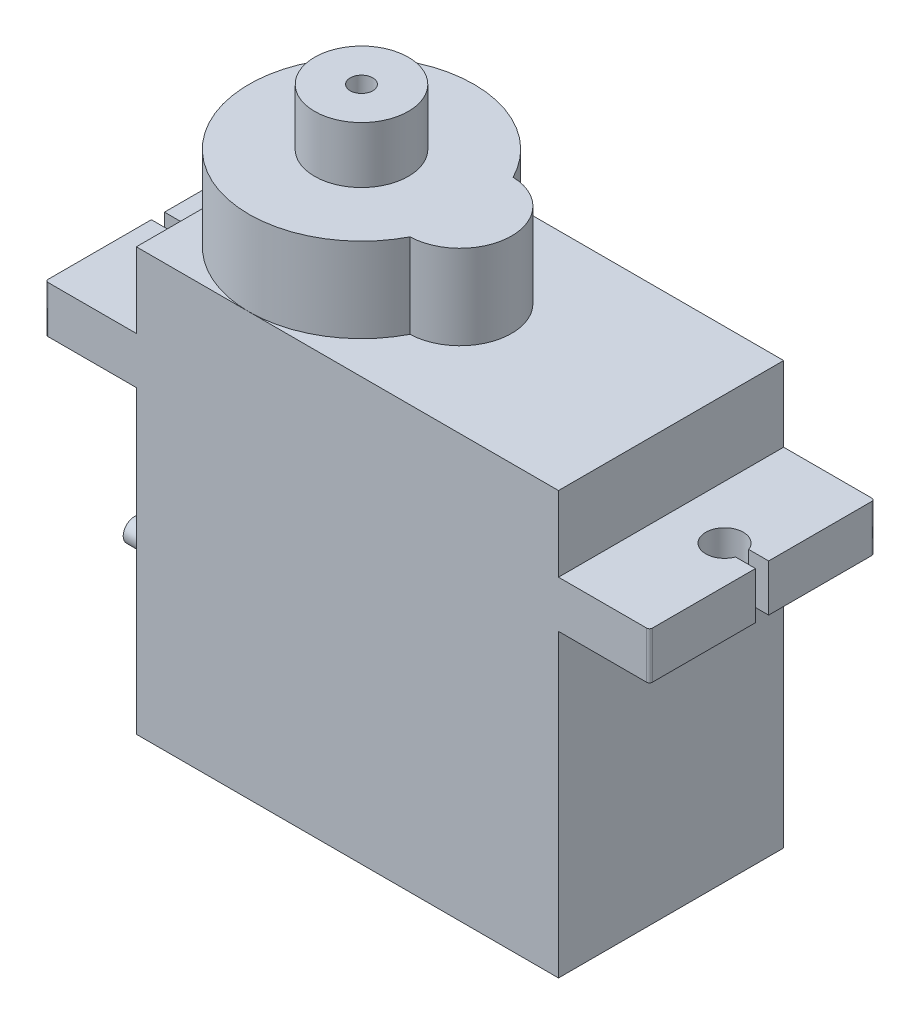
ISO-10303-21;
HEADER;
FILE_DESCRIPTION(('STEP AP214'),'2;1');
FILE_NAME('part.step','',(''),(''),'','','');
FILE_SCHEMA(('AUTOMOTIVE_DESIGN { 1 0 10303 214 1 1 1 1 }'));
ENDSEC;
DATA;
#1=APPLICATION_CONTEXT('core data for automotive mechanical design processes');
#2=APPLICATION_PROTOCOL_DEFINITION('international standard','automotive_design',2000,#1);
#3=PRODUCT_CONTEXT('',#1,'mechanical');
#4=PRODUCT('Part','Part','',(#3));
#5=PRODUCT_RELATED_PRODUCT_CATEGORY('part','',(#4));
#6=PRODUCT_DEFINITION_FORMATION('','',#4);
#7=PRODUCT_DEFINITION_CONTEXT('part definition',#1,'design');
#8=PRODUCT_DEFINITION('design','',#6,#7);
#9=PRODUCT_DEFINITION_SHAPE('','',#8);
#10=(LENGTH_UNIT() NAMED_UNIT(*) SI_UNIT(.MILLI.,.METRE.));
#11=(NAMED_UNIT(*) PLANE_ANGLE_UNIT() SI_UNIT($,.RADIAN.));
#12=(NAMED_UNIT(*) SI_UNIT($,.STERADIAN.) SOLID_ANGLE_UNIT());
#13=UNCERTAINTY_MEASURE_WITH_UNIT(LENGTH_MEASURE(1.E-05),#10,'distance_accuracy_value','');
#14=(GEOMETRIC_REPRESENTATION_CONTEXT(3) GLOBAL_UNCERTAINTY_ASSIGNED_CONTEXT((#13)) GLOBAL_UNIT_ASSIGNED_CONTEXT((#10,
#11,#12)) REPRESENTATION_CONTEXT('',''));
#15=CARTESIAN_POINT('',(0.,0.,0.));
#16=DIRECTION('',(0.,0.,1.));
#17=DIRECTION('',(1.,0.,0.));
#18=AXIS2_PLACEMENT_3D('',#15,#16,#17);
#19=CARTESIAN_POINT('',(11.25,-22.5,6.));
#20=DIRECTION('',(1.,0.,0.));
#21=DIRECTION('',(0.,0.,-1.));
#22=AXIS2_PLACEMENT_3D('',#19,#20,#21);
#23=PLANE('',#22);
#24=DIRECTION('',(0.,1.,0.));
#25=VECTOR('',#24,1.);
#26=CARTESIAN_POINT('',(11.25,-22.5,-6.));
#27=LINE('',#26,#25);
#28=CARTESIAN_POINT('',(11.25,-22.5,-6.));
#29=VERTEX_POINT('',#28);
#30=CARTESIAN_POINT('',(11.25,-6.50000000000001,-6.));
#31=VERTEX_POINT('',#30);
#32=EDGE_CURVE('E498',#29,#31,#27,.T.);
#33=ORIENTED_EDGE('',*,*,#32,.T.);
#34=DIRECTION('',(0.,0.,1.));
#35=VECTOR('',#34,1.);
#36=CARTESIAN_POINT('',(11.25,-6.5,6.));
#37=LINE('',#36,#35);
#38=CARTESIAN_POINT('',(11.25,-6.50000000000001,6.));
#39=VERTEX_POINT('',#38);
#40=EDGE_CURVE('E402',#31,#39,#37,.T.);
#41=ORIENTED_EDGE('',*,*,#40,.T.);
#42=DIRECTION('',(0.,1.,0.));
#43=VECTOR('',#42,1.);
#44=CARTESIAN_POINT('',(11.25,-22.5,6.));
#45=LINE('',#44,#43);
#46=CARTESIAN_POINT('',(11.25,-22.5,6.));
#47=VERTEX_POINT('',#46);
#48=EDGE_CURVE('E483',#47,#39,#45,.T.);
#49=ORIENTED_EDGE('',*,*,#48,.F.);
#50=DIRECTION('',(0.,0.,-1.));
#51=VECTOR('',#50,1.);
#52=CARTESIAN_POINT('',(11.25,-22.5,6.));
#53=LINE('',#52,#51);
#54=EDGE_CURVE('E448',#47,#29,#53,.T.);
#55=ORIENTED_EDGE('',*,*,#54,.T.);
#56=EDGE_LOOP('',(#33,#41,#49,#55));
#57=FACE_BOUND('',#56,.T.);
#58=ADVANCED_FACE('F43',(#57),#23,.T.);
#59=CARTESIAN_POINT('',(-11.25,-22.5,6.));
#60=DIRECTION('',(-1.,0.,0.));
#61=DIRECTION('',(0.,0.,1.));
#62=AXIS2_PLACEMENT_3D('',#59,#60,#61);
#63=PLANE('',#62);
#64=CARTESIAN_POINT('',(-11.25,-18.,0.));
#65=DIRECTION('',(-1.,0.,0.));
#66=DIRECTION('',(0.,0.,1.));
#67=AXIS2_PLACEMENT_3D('',#64,#65,#66);
#68=CIRCLE('',#67,0.6);
#69=CARTESIAN_POINT('',(-11.25,-17.7602084238344,0.55));
#70=VERTEX_POINT('',#69);
#71=CARTESIAN_POINT('',(-11.25,-17.7602084238344,-0.549999999999997));
#72=VERTEX_POINT('',#71);
#73=EDGE_CURVE('E1036',#70,#72,#68,.T.);
#74=ORIENTED_EDGE('',*,*,#73,.F.);
#75=CARTESIAN_POINT('',(-11.25,-18.,1.1));
#76=DIRECTION('',(-1.,0.,0.));
#77=DIRECTION('',(0.,0.,1.));
#78=AXIS2_PLACEMENT_3D('',#75,#76,#77);
#79=CIRCLE('',#78,0.6);
#80=CARTESIAN_POINT('',(-11.25,-18.2397915761656,0.55));
#81=VERTEX_POINT('',#80);
#82=EDGE_CURVE('E278',#81,#70,#79,.T.);
#83=ORIENTED_EDGE('',*,*,#82,.F.);
#84=CARTESIAN_POINT('',(-11.25,-18.,0.));
#85=DIRECTION('',(-1.,0.,0.));
#86=DIRECTION('',(0.,0.,1.));
#87=AXIS2_PLACEMENT_3D('',#84,#85,#86);
#88=CIRCLE('',#87,0.6);
#89=CARTESIAN_POINT('',(-11.25,-18.2397915761656,-0.550000000000003));
#90=VERTEX_POINT('',#89);
#91=EDGE_CURVE('E274',#90,#81,#88,.T.);
#92=ORIENTED_EDGE('',*,*,#91,.F.);
#93=CARTESIAN_POINT('',(-11.25,-18.,-1.1));
#94=DIRECTION('',(1.,0.,0.));
#95=DIRECTION('',(0.,0.,-1.));
#96=AXIS2_PLACEMENT_3D('',#93,#94,#95);
#97=CIRCLE('',#96,0.6);
#98=EDGE_CURVE('E59',#90,#72,#97,.T.);
#99=ORIENTED_EDGE('',*,*,#98,.T.);
#100=EDGE_LOOP('',(#74,#83,#92,#99));
#101=FACE_BOUND('',#100,.T.);
#102=DIRECTION('',(0.,1.,0.));
#103=VECTOR('',#102,1.);
#104=CARTESIAN_POINT('',(-11.25,-22.5,6.));
#105=LINE('',#104,#103);
#106=CARTESIAN_POINT('',(-11.25,-22.5,6.));
#107=VERTEX_POINT('',#106);
#108=CARTESIAN_POINT('',(-11.25,-6.50000000000001,6.));
#109=VERTEX_POINT('',#108);
#110=EDGE_CURVE('E488',#107,#109,#105,.T.);
#111=ORIENTED_EDGE('',*,*,#110,.T.);
#112=DIRECTION('',(0.,0.,-1.));
#113=VECTOR('',#112,1.);
#114=CARTESIAN_POINT('',(-11.25,-6.5,6.));
#115=LINE('',#114,#113);
#116=CARTESIAN_POINT('',(-11.25,-6.50000000000001,-6.));
#117=VERTEX_POINT('',#116);
#118=EDGE_CURVE('E398',#109,#117,#115,.T.);
#119=ORIENTED_EDGE('',*,*,#118,.T.);
#120=DIRECTION('',(0.,1.,0.));
#121=VECTOR('',#120,1.);
#122=CARTESIAN_POINT('',(-11.25,-22.5,-6.));
#123=LINE('',#122,#121);
#124=CARTESIAN_POINT('',(-11.25,-22.5,-6.));
#125=VERTEX_POINT('',#124);
#126=EDGE_CURVE('E493',#125,#117,#123,.T.);
#127=ORIENTED_EDGE('',*,*,#126,.F.);
#128=DIRECTION('',(0.,0.,1.));
#129=VECTOR('',#128,1.);
#130=CARTESIAN_POINT('',(-11.25,-22.5,6.));
#131=LINE('',#130,#129);
#132=EDGE_CURVE('E457',#125,#107,#131,.T.);
#133=ORIENTED_EDGE('',*,*,#132,.T.);
#134=EDGE_LOOP('',(#111,#119,#127,#133));
#135=FACE_BOUND('',#134,.T.);
#136=ADVANCED_FACE('F634',(#101,#135),#63,.T.);
#137=CARTESIAN_POINT('',(0.,0.,0.));
#138=DIRECTION('',(0.,-1.,0.));
#139=DIRECTION('',(0.,0.,-1.));
#140=AXIS2_PLACEMENT_3D('',#137,#138,#139);
#141=PLANE('',#140);
#142=CARTESIAN_POINT('',(-5.25,0.,0.));
#143=DIRECTION('',(0.,1.,0.));
#144=DIRECTION('',(0.,0.,1.));
#145=AXIS2_PLACEMENT_3D('',#142,#143,#144);
#146=CIRCLE('',#145,6.);
#147=CARTESIAN_POINT('',(0.0833333333333311,0.,-2.74873708374511));
#148=VERTEX_POINT('',#147);
#149=CARTESIAN_POINT('',(-5.25,0.,-6.));
#150=VERTEX_POINT('',#149);
#151=EDGE_CURVE('E417',#148,#150,#146,.T.);
#152=ORIENTED_EDGE('',*,*,#151,.F.);
#153=CARTESIAN_POINT('',(0.,0.,0.));
#154=DIRECTION('',(0.,1.,0.));
#155=DIRECTION('',(0.,0.,1.));
#156=AXIS2_PLACEMENT_3D('',#153,#154,#155);
#157=CIRCLE('',#156,2.75);
#158=CARTESIAN_POINT('',(0.0833333333333311,0.,2.74873708374511));
#159=VERTEX_POINT('',#158);
#160=EDGE_CURVE('E429',#159,#148,#157,.T.);
#161=ORIENTED_EDGE('',*,*,#160,.F.);
#162=CARTESIAN_POINT('',(-5.25,0.,6.));
#163=VERTEX_POINT('',#162);
#164=EDGE_CURVE('E436',#163,#159,#146,.T.);
#165=ORIENTED_EDGE('',*,*,#164,.F.);
#166=DIRECTION('',(1.,0.,0.));
#167=VECTOR('',#166,1.);
#168=CARTESIAN_POINT('',(-11.25,0.,6.));
#169=LINE('',#168,#167);
#170=CARTESIAN_POINT('',(11.25,0.,6.));
#171=VERTEX_POINT('',#170);
#172=EDGE_CURVE('E479',#163,#171,#169,.T.);
#173=ORIENTED_EDGE('',*,*,#172,.T.);
#174=DIRECTION('',(0.,0.,-1.));
#175=VECTOR('',#174,1.);
#176=CARTESIAN_POINT('',(11.25,0.,6.));
#177=LINE('',#176,#175);
#178=CARTESIAN_POINT('',(11.25,0.,-6.));
#179=VERTEX_POINT('',#178);
#180=EDGE_CURVE('E447',#171,#179,#177,.T.);
#181=ORIENTED_EDGE('',*,*,#180,.T.);
#182=DIRECTION('',(-1.,0.,0.));
#183=VECTOR('',#182,1.);
#184=CARTESIAN_POINT('',(-11.25,0.,-6.));
#185=LINE('',#184,#183);
#186=EDGE_CURVE('E470',#179,#150,#185,.T.);
#187=ORIENTED_EDGE('',*,*,#186,.T.);
#188=EDGE_LOOP('',(#152,#161,#165,#173,#181,#187));
#189=FACE_BOUND('',#188,.T.);
#190=ADVANCED_FACE('F605',(#189),#141,.F.);
#191=CARTESIAN_POINT('',(-11.25,0.,0.));
#192=VERTEX_POINT('',#191);
#193=EDGE_CURVE('E423',#150,#192,#146,.T.);
#194=ORIENTED_EDGE('',*,*,#193,.F.);
#195=CARTESIAN_POINT('',(-11.25,0.,-6.));
#196=VERTEX_POINT('',#195);
#197=EDGE_CURVE('E469',#150,#196,#185,.T.);
#198=ORIENTED_EDGE('',*,*,#197,.T.);
#199=DIRECTION('',(0.,0.,1.));
#200=VECTOR('',#199,1.);
#201=CARTESIAN_POINT('',(-11.25,0.,6.));
#202=LINE('',#201,#200);
#203=EDGE_CURVE('E475',#196,#192,#202,.T.);
#204=ORIENTED_EDGE('',*,*,#203,.T.);
#205=EDGE_LOOP('',(#194,#198,#204));
#206=FACE_BOUND('',#205,.T.);
#207=ADVANCED_FACE('F596',(#206),#141,.F.);
#208=DIRECTION('',(0.,0.,1.));
#209=VECTOR('',#208,1.);
#210=CARTESIAN_POINT('',(11.25,-4.,6.));
#211=LINE('',#210,#209);
#212=CARTESIAN_POINT('',(11.25,-4.00000000000001,-6.));
#213=VERTEX_POINT('',#212);
#214=CARTESIAN_POINT('',(11.25,-4.,6.));
#215=VERTEX_POINT('',#214);
#216=EDGE_CURVE('E394',#213,#215,#211,.T.);
#217=ORIENTED_EDGE('',*,*,#216,.F.);
#218=EDGE_CURVE('E465',#213,#179,#27,.T.);
#219=ORIENTED_EDGE('',*,*,#218,.T.);
#220=ORIENTED_EDGE('',*,*,#180,.F.);
#221=EDGE_CURVE('E487',#215,#171,#45,.T.);
#222=ORIENTED_EDGE('',*,*,#221,.F.);
#223=EDGE_LOOP('',(#217,#219,#220,#222));
#224=FACE_BOUND('',#223,.T.);
#225=ADVANCED_FACE('F609',(#224),#23,.T.);
#226=CARTESIAN_POINT('',(-11.25,-22.5,6.));
#227=DIRECTION('',(0.,0.,1.));
#228=DIRECTION('',(1.,0.,0.));
#229=AXIS2_PLACEMENT_3D('',#226,#227,#228);
#230=PLANE('',#229);
#231=DIRECTION('',(1.,0.,0.));
#232=VECTOR('',#231,1.);
#233=CARTESIAN_POINT('',(0.,-6.5,6.));
#234=LINE('',#233,#232);
#235=CARTESIAN_POINT('',(15.95,-6.5,6.));
#236=VERTEX_POINT('',#235);
#237=EDGE_CURVE('E307',#39,#236,#234,.T.);
#238=ORIENTED_EDGE('',*,*,#237,.T.);
#239=DIRECTION('',(0.,1.,0.));
#240=VECTOR('',#239,1.);
#241=CARTESIAN_POINT('',(15.95,-22.5,6.));
#242=LINE('',#241,#240);
#243=CARTESIAN_POINT('',(15.95,-4.,6.));
#244=VERTEX_POINT('',#243);
#245=EDGE_CURVE('E540',#236,#244,#242,.T.);
#246=ORIENTED_EDGE('',*,*,#245,.T.);
#247=DIRECTION('',(1.,0.,0.));
#248=VECTOR('',#247,1.);
#249=CARTESIAN_POINT('',(0.,-4.,6.));
#250=LINE('',#249,#248);
#251=EDGE_CURVE('E340',#215,#244,#250,.T.);
#252=ORIENTED_EDGE('',*,*,#251,.F.);
#253=ORIENTED_EDGE('',*,*,#221,.T.);
#254=ORIENTED_EDGE('',*,*,#172,.F.);
#255=CARTESIAN_POINT('',(-11.25,0.,6.));
#256=VERTEX_POINT('',#255);
#257=EDGE_CURVE('E453',#256,#163,#169,.T.);
#258=ORIENTED_EDGE('',*,*,#257,.F.);
#259=CARTESIAN_POINT('',(-11.25,-4.00000000000001,6.));
#260=VERTEX_POINT('',#259);
#261=EDGE_CURVE('E492',#260,#256,#105,.T.);
#262=ORIENTED_EDGE('',*,*,#261,.F.);
#263=CARTESIAN_POINT('',(-15.95,-4.,6.));
#264=VERTEX_POINT('',#263);
#265=EDGE_CURVE('E341',#264,#260,#250,.T.);
#266=ORIENTED_EDGE('',*,*,#265,.F.);
#267=DIRECTION('',(0.,1.,0.));
#268=VECTOR('',#267,1.);
#269=CARTESIAN_POINT('',(-15.95,-6.5,6.));
#270=LINE('',#269,#268);
#271=CARTESIAN_POINT('',(-15.95,-6.5,6.));
#272=VERTEX_POINT('',#271);
#273=EDGE_CURVE('E537',#264,#272,#270,.F.);
#274=ORIENTED_EDGE('',*,*,#273,.T.);
#275=EDGE_CURVE('E309',#272,#109,#234,.T.);
#276=ORIENTED_EDGE('',*,*,#275,.T.);
#277=ORIENTED_EDGE('',*,*,#110,.F.);
#278=DIRECTION('',(1.,0.,0.));
#279=VECTOR('',#278,1.);
#280=CARTESIAN_POINT('',(-11.25,-22.5,6.));
#281=LINE('',#280,#279);
#282=EDGE_CURVE('E461',#107,#47,#281,.T.);
#283=ORIENTED_EDGE('',*,*,#282,.T.);
#284=ORIENTED_EDGE('',*,*,#48,.T.);
#285=EDGE_LOOP('',(#238,#246,#252,#253,#254,#258,#262,#266,#274,#276,#277,#283,#284));
#286=FACE_BOUND('',#285,.T.);
#287=ADVANCED_FACE('F558',(#286),#230,.T.);
#288=DIRECTION('',(0.,0.,-1.));
#289=VECTOR('',#288,1.);
#290=CARTESIAN_POINT('',(-11.25,-4.,6.));
#291=LINE('',#290,#289);
#292=CARTESIAN_POINT('',(-11.25,-4.,-6.));
#293=VERTEX_POINT('',#292);
#294=EDGE_CURVE('E366',#260,#293,#291,.T.);
#295=ORIENTED_EDGE('',*,*,#294,.F.);
#296=ORIENTED_EDGE('',*,*,#261,.T.);
#297=EDGE_CURVE('E474',#192,#256,#202,.T.);
#298=ORIENTED_EDGE('',*,*,#297,.F.);
#299=ORIENTED_EDGE('',*,*,#203,.F.);
#300=EDGE_CURVE('E497',#293,#196,#123,.T.);
#301=ORIENTED_EDGE('',*,*,#300,.F.);
#302=EDGE_LOOP('',(#295,#296,#298,#299,#301));
#303=FACE_BOUND('',#302,.T.);
#304=ADVANCED_FACE('F690',(#303),#63,.T.);
#305=CARTESIAN_POINT('',(-11.25,-22.5,-6.));
#306=DIRECTION('',(0.,0.,-1.));
#307=DIRECTION('',(-1.,0.,0.));
#308=AXIS2_PLACEMENT_3D('',#305,#306,#307);
#309=PLANE('',#308);
#310=DIRECTION('',(1.,0.,0.));
#311=VECTOR('',#310,1.);
#312=CARTESIAN_POINT('',(0.,-6.5,-6.));
#313=LINE('',#312,#311);
#314=CARTESIAN_POINT('',(-15.95,-6.5,-6.));
#315=VERTEX_POINT('',#314);
#316=EDGE_CURVE('E326',#315,#117,#313,.T.);
#317=ORIENTED_EDGE('',*,*,#316,.F.);
#318=DIRECTION('',(0.,1.,0.));
#319=VECTOR('',#318,1.);
#320=CARTESIAN_POINT('',(-15.95,-4.,-6.));
#321=LINE('',#320,#319);
#322=CARTESIAN_POINT('',(-15.95,-4.,-6.));
#323=VERTEX_POINT('',#322);
#324=EDGE_CURVE('E503',#315,#323,#321,.T.);
#325=ORIENTED_EDGE('',*,*,#324,.T.);
#326=DIRECTION('',(1.,0.,0.));
#327=VECTOR('',#326,1.);
#328=CARTESIAN_POINT('',(0.,-4.,-6.));
#329=LINE('',#328,#327);
#330=EDGE_CURVE('E359',#323,#293,#329,.T.);
#331=ORIENTED_EDGE('',*,*,#330,.T.);
#332=ORIENTED_EDGE('',*,*,#300,.T.);
#333=ORIENTED_EDGE('',*,*,#197,.F.);
#334=ORIENTED_EDGE('',*,*,#186,.F.);
#335=ORIENTED_EDGE('',*,*,#218,.F.);
#336=CARTESIAN_POINT('',(15.95,-4.,-6.));
#337=VERTEX_POINT('',#336);
#338=EDGE_CURVE('E362',#213,#337,#329,.T.);
#339=ORIENTED_EDGE('',*,*,#338,.T.);
#340=DIRECTION('',(0.,1.,0.));
#341=VECTOR('',#340,1.);
#342=CARTESIAN_POINT('',(15.95,-22.5,-6.));
#343=LINE('',#342,#341);
#344=CARTESIAN_POINT('',(15.95,-6.5,-6.));
#345=VERTEX_POINT('',#344);
#346=EDGE_CURVE('E422',#337,#345,#343,.F.);
#347=ORIENTED_EDGE('',*,*,#346,.T.);
#348=EDGE_CURVE('E328',#31,#345,#313,.T.);
#349=ORIENTED_EDGE('',*,*,#348,.F.);
#350=ORIENTED_EDGE('',*,*,#32,.F.);
#351=DIRECTION('',(-1.,0.,0.));
#352=VECTOR('',#351,1.);
#353=CARTESIAN_POINT('',(-11.25,-22.5,-6.));
#354=LINE('',#353,#352);
#355=EDGE_CURVE('E452',#29,#125,#354,.T.);
#356=ORIENTED_EDGE('',*,*,#355,.T.);
#357=ORIENTED_EDGE('',*,*,#126,.T.);
#358=EDGE_LOOP('',(#317,#325,#331,#332,#333,#334,#335,#339,#347,#349,#350,#356,#357));
#359=FACE_BOUND('',#358,.T.);
#360=ADVANCED_FACE('F601',(#359),#309,.T.);
#361=CARTESIAN_POINT('',(0.,-22.5,0.));
#362=DIRECTION('',(0.,-1.,0.));
#363=DIRECTION('',(0.,0.,-1.));
#364=AXIS2_PLACEMENT_3D('',#361,#362,#363);
#365=PLANE('',#364);
#366=ORIENTED_EDGE('',*,*,#54,.F.);
#367=ORIENTED_EDGE('',*,*,#282,.F.);
#368=ORIENTED_EDGE('',*,*,#132,.F.);
#369=ORIENTED_EDGE('',*,*,#355,.F.);
#370=EDGE_LOOP('',(#366,#367,#368,#369));
#371=FACE_BOUND('',#370,.T.);
#372=ADVANCED_FACE('F629',(#371),#365,.T.);
#373=EDGE_CURVE('E588',#192,#163,#146,.T.);
#374=ORIENTED_EDGE('',*,*,#373,.F.);
#375=ORIENTED_EDGE('',*,*,#297,.T.);
#376=ORIENTED_EDGE('',*,*,#257,.T.);
#377=EDGE_LOOP('',(#374,#375,#376));
#378=FACE_BOUND('',#377,.T.);
#379=ADVANCED_FACE('F700',(#378),#141,.F.);
#380=CARTESIAN_POINT('',(-5.25,4.5,0.));
#381=DIRECTION('',(0.,-1.,0.));
#382=DIRECTION('',(0.,0.,-1.));
#383=AXIS2_PLACEMENT_3D('',#380,#381,#382);
#384=CYLINDRICAL_SURFACE('',#383,6.);
#385=ORIENTED_EDGE('',*,*,#151,.T.);
#386=ORIENTED_EDGE('',*,*,#193,.T.);
#387=ORIENTED_EDGE('',*,*,#373,.T.);
#388=ORIENTED_EDGE('',*,*,#164,.T.);
#389=DIRECTION('',(0.,-1.,0.));
#390=VECTOR('',#389,1.);
#391=CARTESIAN_POINT('',(0.0833333333333311,4.5,2.74873708374511));
#392=LINE('',#391,#390);
#393=CARTESIAN_POINT('',(0.0833333333333311,4.5,2.74873708374511));
#394=VERTEX_POINT('',#393);
#395=EDGE_CURVE('E443',#394,#159,#392,.T.);
#396=ORIENTED_EDGE('',*,*,#395,.F.);
#397=CARTESIAN_POINT('',(-5.25,4.5,0.));
#398=DIRECTION('',(0.,1.,0.));
#399=DIRECTION('',(0.,0.,1.));
#400=AXIS2_PLACEMENT_3D('',#397,#398,#399);
#401=CIRCLE('',#400,6.);
#402=CARTESIAN_POINT('',(0.0833333333333311,4.5,-2.74873708374511));
#403=VERTEX_POINT('',#402);
#404=EDGE_CURVE('E424',#403,#394,#401,.T.);
#405=ORIENTED_EDGE('',*,*,#404,.F.);
#406=DIRECTION('',(0.,-1.,0.));
#407=VECTOR('',#406,1.);
#408=CARTESIAN_POINT('',(0.0833333333333311,4.5,-2.74873708374511));
#409=LINE('',#408,#407);
#410=EDGE_CURVE('E432',#403,#148,#409,.T.);
#411=ORIENTED_EDGE('',*,*,#410,.T.);
#412=EDGE_LOOP('',(#385,#386,#387,#388,#396,#405,#411));
#413=FACE_BOUND('',#412,.T.);
#414=ADVANCED_FACE('F593',(#413),#384,.T.);
#415=CARTESIAN_POINT('',(0.,4.5,0.));
#416=DIRECTION('',(0.,-1.,0.));
#417=DIRECTION('',(0.,0.,-1.));
#418=AXIS2_PLACEMENT_3D('',#415,#416,#417);
#419=CYLINDRICAL_SURFACE('',#418,2.75);
#420=ORIENTED_EDGE('',*,*,#160,.T.);
#421=ORIENTED_EDGE('',*,*,#410,.F.);
#422=CARTESIAN_POINT('',(0.,4.5,0.));
#423=DIRECTION('',(0.,1.,0.));
#424=DIRECTION('',(0.,0.,1.));
#425=AXIS2_PLACEMENT_3D('',#422,#423,#424);
#426=CIRCLE('',#425,2.75);
#427=EDGE_CURVE('E428',#394,#403,#426,.T.);
#428=ORIENTED_EDGE('',*,*,#427,.F.);
#429=ORIENTED_EDGE('',*,*,#395,.T.);
#430=EDGE_LOOP('',(#420,#421,#428,#429));
#431=FACE_BOUND('',#430,.T.);
#432=ADVANCED_FACE('F711',(#431),#419,.T.);
#433=CARTESIAN_POINT('',(0.,4.5,0.));
#434=DIRECTION('',(0.,1.,0.));
#435=DIRECTION('',(0.,0.,1.));
#436=AXIS2_PLACEMENT_3D('',#433,#434,#435);
#437=PLANE('',#436);
#438=CARTESIAN_POINT('',(-5.25,4.5,0.));
#439=DIRECTION('',(0.,1.,0.));
#440=DIRECTION('',(0.,0.,1.));
#441=AXIS2_PLACEMENT_3D('',#438,#439,#440);
#442=CIRCLE('',#441,2.5);
#443=CARTESIAN_POINT('',(-5.25,4.5,2.5));
#444=VERTEX_POINT('',#443);
#445=EDGE_CURVE('E418',#444,#444,#442,.T.);
#446=ORIENTED_EDGE('',*,*,#445,.F.);
#447=EDGE_LOOP('',(#446));
#448=FACE_BOUND('',#447,.T.);
#449=ORIENTED_EDGE('',*,*,#404,.T.);
#450=ORIENTED_EDGE('',*,*,#427,.T.);
#451=EDGE_LOOP('',(#449,#450));
#452=FACE_BOUND('',#451,.T.);
#453=ADVANCED_FACE('F757',(#448,#452),#437,.T.);
#454=CARTESIAN_POINT('',(-5.25,7.5,0.));
#455=DIRECTION('',(0.,-1.,0.));
#456=DIRECTION('',(0.,0.,-1.));
#457=AXIS2_PLACEMENT_3D('',#454,#455,#456);
#458=CYLINDRICAL_SURFACE('',#457,2.5);
#459=CARTESIAN_POINT('',(-5.25,7.5,0.));
#460=DIRECTION('',(0.,1.,0.));
#461=DIRECTION('',(0.,0.,1.));
#462=AXIS2_PLACEMENT_3D('',#459,#460,#461);
#463=CIRCLE('',#462,2.5);
#464=CARTESIAN_POINT('',(-5.25,7.5,2.5));
#465=VERTEX_POINT('',#464);
#466=EDGE_CURVE('E410',#465,#465,#463,.T.);
#467=ORIENTED_EDGE('',*,*,#466,.F.);
#468=EDGE_LOOP('',(#467));
#469=FACE_BOUND('',#468,.T.);
#470=ORIENTED_EDGE('',*,*,#445,.T.);
#471=EDGE_LOOP('',(#470));
#472=FACE_BOUND('',#471,.T.);
#473=ADVANCED_FACE('F768',(#469,#472),#458,.T.);
#474=CARTESIAN_POINT('',(-5.25,7.5,0.));
#475=DIRECTION('',(0.,1.,0.));
#476=DIRECTION('',(0.,0.,1.));
#477=AXIS2_PLACEMENT_3D('',#474,#475,#476);
#478=PLANE('',#477);
#479=CARTESIAN_POINT('',(-5.25,7.5,0.));
#480=DIRECTION('',(0.,1.,0.));
#481=DIRECTION('',(0.,0.,1.));
#482=AXIS2_PLACEMENT_3D('',#479,#480,#481);
#483=CIRCLE('',#482,0.6);
#484=CARTESIAN_POINT('',(-5.25,7.5,0.6));
#485=VERTEX_POINT('',#484);
#486=EDGE_CURVE('E405',#485,#485,#483,.T.);
#487=ORIENTED_EDGE('',*,*,#486,.F.);
#488=EDGE_LOOP('',(#487));
#489=FACE_BOUND('',#488,.T.);
#490=ORIENTED_EDGE('',*,*,#466,.T.);
#491=EDGE_LOOP('',(#490));
#492=FACE_BOUND('',#491,.T.);
#493=ADVANCED_FACE('F779',(#489,#492),#478,.T.);
#494=CARTESIAN_POINT('',(-5.25,4.5,0.));
#495=DIRECTION('',(0.,1.,0.));
#496=DIRECTION('',(0.,0.,1.));
#497=AXIS2_PLACEMENT_3D('',#494,#495,#496);
#498=CYLINDRICAL_SURFACE('',#497,0.6);
#499=CARTESIAN_POINT('',(-5.25,4.5,0.));
#500=DIRECTION('',(0.,1.,0.));
#501=DIRECTION('',(0.,0.,1.));
#502=AXIS2_PLACEMENT_3D('',#499,#500,#501);
#503=CIRCLE('',#502,0.6);
#504=CARTESIAN_POINT('',(-5.25,4.5,0.6));
#505=VERTEX_POINT('',#504);
#506=EDGE_CURVE('E406',#505,#505,#503,.T.);
#507=ORIENTED_EDGE('',*,*,#506,.F.);
#508=EDGE_LOOP('',(#507));
#509=FACE_BOUND('',#508,.T.);
#510=ORIENTED_EDGE('',*,*,#486,.T.);
#511=EDGE_LOOP('',(#510));
#512=FACE_BOUND('',#511,.T.);
#513=ADVANCED_FACE('F790',(#509,#512),#498,.F.);
#514=CARTESIAN_POINT('',(-5.25,4.5,0.));
#515=DIRECTION('',(0.,1.,0.));
#516=DIRECTION('',(0.,0.,1.));
#517=AXIS2_PLACEMENT_3D('',#514,#515,#516);
#518=PLANE('',#517);
#519=ORIENTED_EDGE('',*,*,#506,.T.);
#520=EDGE_LOOP('',(#519));
#521=FACE_BOUND('',#520,.T.);
#522=ADVANCED_FACE('F801',(#521),#518,.T.);
#523=CARTESIAN_POINT('',(-16.1,-6.5,0.));
#524=DIRECTION('',(1.,0.,0.));
#525=DIRECTION('',(0.,0.,-1.));
#526=AXIS2_PLACEMENT_3D('',#523,#524,#525);
#527=PLANE('',#526);
#528=DIRECTION('',(0.,0.,-1.));
#529=VECTOR('',#528,1.);
#530=CARTESIAN_POINT('',(-16.1,-6.5,0.));
#531=LINE('',#530,#529);
#532=CARTESIAN_POINT('',(-16.1,-6.5,5.85));
#533=VERTEX_POINT('',#532);
#534=CARTESIAN_POINT('',(-16.1,-6.5,0.350000000000008));
#535=VERTEX_POINT('',#534);
#536=EDGE_CURVE('E304',#533,#535,#531,.T.);
#537=ORIENTED_EDGE('',*,*,#536,.F.);
#538=DIRECTION('',(0.,1.,0.));
#539=VECTOR('',#538,1.);
#540=CARTESIAN_POINT('',(-16.1,-4.,5.85));
#541=LINE('',#540,#539);
#542=CARTESIAN_POINT('',(-16.1,-4.,5.85));
#543=VERTEX_POINT('',#542);
#544=EDGE_CURVE('E11',#533,#543,#541,.T.);
#545=ORIENTED_EDGE('',*,*,#544,.T.);
#546=DIRECTION('',(0.,0.,-1.));
#547=VECTOR('',#546,1.);
#548=CARTESIAN_POINT('',(-16.1,-4.,0.));
#549=LINE('',#548,#547);
#550=CARTESIAN_POINT('',(-16.1,-4.,0.350000000000008));
#551=VERTEX_POINT('',#550);
#552=EDGE_CURVE('E337',#543,#551,#549,.T.);
#553=ORIENTED_EDGE('',*,*,#552,.T.);
#554=DIRECTION('',(0.,1.,0.));
#555=VECTOR('',#554,1.);
#556=CARTESIAN_POINT('',(-16.1,-6.5,0.350000000000008));
#557=LINE('',#556,#555);
#558=EDGE_CURVE('E381',#535,#551,#557,.T.);
#559=ORIENTED_EDGE('',*,*,#558,.F.);
#560=EDGE_LOOP('',(#537,#545,#553,#559));
#561=FACE_BOUND('',#560,.T.);
#562=ADVANCED_FACE('F665',(#561),#527,.F.);
#563=CARTESIAN_POINT('',(0.,-6.5,0.350000000000005));
#564=DIRECTION('',(0.,0.,1.));
#565=DIRECTION('',(1.,0.,0.));
#566=AXIS2_PLACEMENT_3D('',#563,#564,#565);
#567=PLANE('',#566);
#568=DIRECTION('',(1.,0.,0.));
#569=VECTOR('',#568,1.);
#570=CARTESIAN_POINT('',(0.,-4.,0.350000000000005));
#571=LINE('',#570,#569);
#572=CARTESIAN_POINT('',(-15.0367496997598,-4.,0.350000000000008));
#573=VERTEX_POINT('',#572);
#574=EDGE_CURVE('E333',#551,#573,#571,.T.);
#575=ORIENTED_EDGE('',*,*,#574,.T.);
#576=DIRECTION('',(0.,1.,0.));
#577=VECTOR('',#576,1.);
#578=CARTESIAN_POINT('',(-15.0367496997598,-6.5,0.350000000000008));
#579=LINE('',#578,#577);
#580=CARTESIAN_POINT('',(-15.0367496997598,-6.5,0.350000000000008));
#581=VERTEX_POINT('',#580);
#582=EDGE_CURVE('E385',#581,#573,#579,.T.);
#583=ORIENTED_EDGE('',*,*,#582,.F.);
#584=DIRECTION('',(1.,0.,0.));
#585=VECTOR('',#584,1.);
#586=CARTESIAN_POINT('',(0.,-6.5,0.350000000000005));
#587=LINE('',#586,#585);
#588=EDGE_CURVE('E301',#535,#581,#587,.T.);
#589=ORIENTED_EDGE('',*,*,#588,.F.);
#590=ORIENTED_EDGE('',*,*,#558,.T.);
#591=EDGE_LOOP('',(#575,#583,#589,#590));
#592=FACE_BOUND('',#591,.T.);
#593=ADVANCED_FACE('F661',(#592),#567,.F.);
#594=CARTESIAN_POINT('',(-14.1,-6.5,0.));
#595=DIRECTION('',(0.,1.,0.));
#596=DIRECTION('',(0.,0.,1.));
#597=AXIS2_PLACEMENT_3D('',#594,#595,#596);
#598=CYLINDRICAL_SURFACE('',#597,1.);
#599=CARTESIAN_POINT('',(-14.1,-4.,0.));
#600=DIRECTION('',(0.,1.,0.));
#601=DIRECTION('',(0.,0.,1.));
#602=AXIS2_PLACEMENT_3D('',#599,#600,#601);
#603=CIRCLE('',#602,1.);
#604=CARTESIAN_POINT('',(-15.0367496997598,-4.,-0.350000000000008));
#605=VERTEX_POINT('',#604);
#606=EDGE_CURVE('E286',#605,#573,#603,.F.);
#607=ORIENTED_EDGE('',*,*,#606,.F.);
#608=DIRECTION('',(0.,1.,0.));
#609=VECTOR('',#608,1.);
#610=CARTESIAN_POINT('',(-15.0367496997598,-6.5,-0.350000000000008));
#611=LINE('',#610,#609);
#612=CARTESIAN_POINT('',(-15.0367496997598,-6.5,-0.350000000000008));
#613=VERTEX_POINT('',#612);
#614=EDGE_CURVE('E388',#613,#605,#611,.T.);
#615=ORIENTED_EDGE('',*,*,#614,.F.);
#616=CARTESIAN_POINT('',(-14.1,-6.5,0.));
#617=DIRECTION('',(0.,1.,0.));
#618=DIRECTION('',(0.,0.,1.));
#619=AXIS2_PLACEMENT_3D('',#616,#617,#618);
#620=CIRCLE('',#619,1.);
#621=EDGE_CURVE('E296',#613,#581,#620,.F.);
#622=ORIENTED_EDGE('',*,*,#621,.T.);
#623=ORIENTED_EDGE('',*,*,#582,.T.);
#624=EDGE_LOOP('',(#607,#615,#622,#623));
#625=FACE_BOUND('',#624,.T.);
#626=ADVANCED_FACE('F656',(#625),#598,.F.);
#627=CARTESIAN_POINT('',(0.,-6.5,-0.350000000000005));
#628=DIRECTION('',(0.,0.,1.));
#629=DIRECTION('',(1.,0.,0.));
#630=AXIS2_PLACEMENT_3D('',#627,#628,#629);
#631=PLANE('',#630);
#632=DIRECTION('',(1.,0.,0.));
#633=VECTOR('',#632,1.);
#634=CARTESIAN_POINT('',(0.,-4.,-0.350000000000005));
#635=LINE('',#634,#633);
#636=CARTESIAN_POINT('',(-16.1,-4.,-0.350000000000008));
#637=VERTEX_POINT('',#636);
#638=EDGE_CURVE('E281',#637,#605,#635,.T.);
#639=ORIENTED_EDGE('',*,*,#638,.F.);
#640=DIRECTION('',(0.,1.,0.));
#641=VECTOR('',#640,1.);
#642=CARTESIAN_POINT('',(-16.1,-6.5,-0.350000000000008));
#643=LINE('',#642,#641);
#644=CARTESIAN_POINT('',(-16.1,-6.5,-0.350000000000008));
#645=VERTEX_POINT('',#644);
#646=EDGE_CURVE('E363',#645,#637,#643,.T.);
#647=ORIENTED_EDGE('',*,*,#646,.F.);
#648=DIRECTION('',(1.,0.,0.));
#649=VECTOR('',#648,1.);
#650=CARTESIAN_POINT('',(0.,-6.5,-0.350000000000005));
#651=LINE('',#650,#649);
#652=EDGE_CURVE('E292',#645,#613,#651,.T.);
#653=ORIENTED_EDGE('',*,*,#652,.T.);
#654=ORIENTED_EDGE('',*,*,#614,.T.);
#655=EDGE_LOOP('',(#639,#647,#653,#654));
#656=FACE_BOUND('',#655,.T.);
#657=ADVANCED_FACE('F651',(#656),#631,.T.);
#658=CARTESIAN_POINT('',(-16.1,-4.,-5.85));
#659=VERTEX_POINT('',#658);
#660=EDGE_CURVE('E297',#637,#659,#549,.T.);
#661=ORIENTED_EDGE('',*,*,#660,.T.);
#662=DIRECTION('',(0.,1.,0.));
#663=VECTOR('',#662,1.);
#664=CARTESIAN_POINT('',(-16.1,-6.5,-5.85));
#665=LINE('',#664,#663);
#666=CARTESIAN_POINT('',(-16.1,-6.5,-5.85));
#667=VERTEX_POINT('',#666);
#668=EDGE_CURVE('E513',#659,#667,#665,.F.);
#669=ORIENTED_EDGE('',*,*,#668,.T.);
#670=EDGE_CURVE('E308',#645,#667,#531,.T.);
#671=ORIENTED_EDGE('',*,*,#670,.F.);
#672=ORIENTED_EDGE('',*,*,#646,.T.);
#673=EDGE_LOOP('',(#661,#669,#671,#672));
#674=FACE_BOUND('',#673,.T.);
#675=ADVANCED_FACE('F647',(#674),#527,.F.);
#676=CARTESIAN_POINT('',(0.,-4.,0.));
#677=DIRECTION('',(0.,1.,0.));
#678=DIRECTION('',(0.,0.,1.));
#679=AXIS2_PLACEMENT_3D('',#676,#677,#678);
#680=PLANE('',#679);
#681=ORIENTED_EDGE('',*,*,#330,.F.);
#682=CARTESIAN_POINT('',(-15.95,-4.,-5.85));
#683=DIRECTION('',(0.,1.,0.));
#684=DIRECTION('',(0.,0.,1.));
#685=AXIS2_PLACEMENT_3D('',#682,#683,#684);
#686=CIRCLE('',#685,0.15);
#687=EDGE_CURVE('E510',#323,#659,#686,.T.);
#688=ORIENTED_EDGE('',*,*,#687,.T.);
#689=ORIENTED_EDGE('',*,*,#660,.F.);
#690=ORIENTED_EDGE('',*,*,#638,.T.);
#691=ORIENTED_EDGE('',*,*,#606,.T.);
#692=ORIENTED_EDGE('',*,*,#574,.F.);
#693=ORIENTED_EDGE('',*,*,#552,.F.);
#694=CARTESIAN_POINT('',(-15.95,-4.,5.85));
#695=DIRECTION('',(0.,1.,0.));
#696=DIRECTION('',(0.,0.,1.));
#697=AXIS2_PLACEMENT_3D('',#694,#695,#696);
#698=CIRCLE('',#697,0.15);
#699=EDGE_CURVE('E507',#543,#264,#698,.T.);
#700=ORIENTED_EDGE('',*,*,#699,.T.);
#701=ORIENTED_EDGE('',*,*,#265,.T.);
#702=ORIENTED_EDGE('',*,*,#294,.T.);
#703=EDGE_LOOP('',(#681,#688,#689,#690,#691,#692,#693,#700,#701,#702));
#704=FACE_BOUND('',#703,.T.);
#705=ADVANCED_FACE('F644',(#704),#680,.T.);
#706=CARTESIAN_POINT('',(0.,-6.5,0.));
#707=DIRECTION('',(0.,1.,0.));
#708=DIRECTION('',(0.,0.,1.));
#709=AXIS2_PLACEMENT_3D('',#706,#707,#708);
#710=PLANE('',#709);
#711=ORIENTED_EDGE('',*,*,#670,.T.);
#712=CARTESIAN_POINT('',(-15.95,-6.5,-5.85));
#713=DIRECTION('',(0.,1.,0.));
#714=DIRECTION('',(0.,0.,1.));
#715=AXIS2_PLACEMENT_3D('',#712,#713,#714);
#716=CIRCLE('',#715,0.15);
#717=EDGE_CURVE('E519',#667,#315,#716,.F.);
#718=ORIENTED_EDGE('',*,*,#717,.T.);
#719=ORIENTED_EDGE('',*,*,#316,.T.);
#720=ORIENTED_EDGE('',*,*,#118,.F.);
#721=ORIENTED_EDGE('',*,*,#275,.F.);
#722=CARTESIAN_POINT('',(-15.95,-6.5,5.85));
#723=DIRECTION('',(0.,1.,0.));
#724=DIRECTION('',(0.,0.,1.));
#725=AXIS2_PLACEMENT_3D('',#722,#723,#724);
#726=CIRCLE('',#725,0.15);
#727=EDGE_CURVE('E516',#272,#533,#726,.F.);
#728=ORIENTED_EDGE('',*,*,#727,.T.);
#729=ORIENTED_EDGE('',*,*,#536,.T.);
#730=ORIENTED_EDGE('',*,*,#588,.T.);
#731=ORIENTED_EDGE('',*,*,#621,.F.);
#732=ORIENTED_EDGE('',*,*,#652,.F.);
#733=EDGE_LOOP('',(#711,#718,#719,#720,#721,#728,#729,#730,#731,#732));
#734=FACE_BOUND('',#733,.T.);
#735=ADVANCED_FACE('F674',(#734),#710,.F.);
#736=ORIENTED_EDGE('',*,*,#348,.T.);
#737=CARTESIAN_POINT('',(15.95,-6.5,-5.85));
#738=DIRECTION('',(0.,1.,0.));
#739=DIRECTION('',(0.,0.,1.));
#740=AXIS2_PLACEMENT_3D('',#737,#738,#739);
#741=CIRCLE('',#740,0.15);
#742=CARTESIAN_POINT('',(16.1,-6.5,-5.85));
#743=VERTEX_POINT('',#742);
#744=EDGE_CURVE('E534',#345,#743,#741,.F.);
#745=ORIENTED_EDGE('',*,*,#744,.T.);
#746=DIRECTION('',(0.,0.,-1.));
#747=VECTOR('',#746,1.);
#748=CARTESIAN_POINT('',(16.1,-6.5,0.));
#749=LINE('',#748,#747);
#750=CARTESIAN_POINT('',(16.1,-6.5,-0.350000000000008));
#751=VERTEX_POINT('',#750);
#752=EDGE_CURVE('E316',#751,#743,#749,.T.);
#753=ORIENTED_EDGE('',*,*,#752,.F.);
#754=DIRECTION('',(-1.,0.,0.));
#755=VECTOR('',#754,1.);
#756=CARTESIAN_POINT('',(0.,-6.5,-0.350000000000005));
#757=LINE('',#756,#755);
#758=CARTESIAN_POINT('',(15.0367496997598,-6.5,-0.350000000000008));
#759=VERTEX_POINT('',#758);
#760=EDGE_CURVE('E323',#751,#759,#757,.T.);
#761=ORIENTED_EDGE('',*,*,#760,.T.);
#762=CARTESIAN_POINT('',(14.1,-6.5,0.));
#763=DIRECTION('',(0.,1.,0.));
#764=DIRECTION('',(0.,0.,1.));
#765=AXIS2_PLACEMENT_3D('',#762,#763,#764);
#766=CIRCLE('',#765,1.);
#767=CARTESIAN_POINT('',(15.0367496997598,-6.5,0.350000000000008));
#768=VERTEX_POINT('',#767);
#769=EDGE_CURVE('E320',#759,#768,#766,.T.);
#770=ORIENTED_EDGE('',*,*,#769,.T.);
#771=DIRECTION('',(-1.,0.,0.));
#772=VECTOR('',#771,1.);
#773=CARTESIAN_POINT('',(0.,-6.5,0.350000000000005));
#774=LINE('',#773,#772);
#775=CARTESIAN_POINT('',(16.1,-6.5,0.350000000000008));
#776=VERTEX_POINT('',#775);
#777=EDGE_CURVE('E315',#776,#768,#774,.T.);
#778=ORIENTED_EDGE('',*,*,#777,.F.);
#779=CARTESIAN_POINT('',(16.1,-6.5,5.85));
#780=VERTEX_POINT('',#779);
#781=EDGE_CURVE('E312',#780,#776,#749,.T.);
#782=ORIENTED_EDGE('',*,*,#781,.F.);
#783=CARTESIAN_POINT('',(15.95,-6.5,5.85));
#784=DIRECTION('',(0.,1.,0.));
#785=DIRECTION('',(0.,0.,1.));
#786=AXIS2_PLACEMENT_3D('',#783,#784,#785);
#787=CIRCLE('',#786,0.15);
#788=EDGE_CURVE('E67',#780,#236,#787,.F.);
#789=ORIENTED_EDGE('',*,*,#788,.T.);
#790=ORIENTED_EDGE('',*,*,#237,.F.);
#791=ORIENTED_EDGE('',*,*,#40,.F.);
#792=EDGE_LOOP('',(#736,#745,#753,#761,#770,#778,#782,#789,#790,#791));
#793=FACE_BOUND('',#792,.T.);
#794=ADVANCED_FACE('F552',(#793),#710,.F.);
#795=DIRECTION('',(0.,0.,-1.));
#796=VECTOR('',#795,1.);
#797=CARTESIAN_POINT('',(16.1,-4.,0.));
#798=LINE('',#797,#796);
#799=CARTESIAN_POINT('',(16.1,-4.,-0.350000000000008));
#800=VERTEX_POINT('',#799);
#801=CARTESIAN_POINT('',(16.1,-4.,-5.85));
#802=VERTEX_POINT('',#801);
#803=EDGE_CURVE('E348',#800,#802,#798,.T.);
#804=ORIENTED_EDGE('',*,*,#803,.T.);
#805=CARTESIAN_POINT('',(15.95,-4.,-5.85));
#806=DIRECTION('',(0.,1.,0.));
#807=DIRECTION('',(0.,0.,1.));
#808=AXIS2_PLACEMENT_3D('',#805,#806,#807);
#809=CIRCLE('',#808,0.15);
#810=EDGE_CURVE('E529',#802,#337,#809,.T.);
#811=ORIENTED_EDGE('',*,*,#810,.T.);
#812=ORIENTED_EDGE('',*,*,#338,.F.);
#813=ORIENTED_EDGE('',*,*,#216,.T.);
#814=ORIENTED_EDGE('',*,*,#251,.T.);
#815=CARTESIAN_POINT('',(15.95,-4.,5.85));
#816=DIRECTION('',(0.,1.,0.));
#817=DIRECTION('',(0.,0.,1.));
#818=AXIS2_PLACEMENT_3D('',#815,#816,#817);
#819=CIRCLE('',#818,0.15);
#820=CARTESIAN_POINT('',(16.1,-4.,5.85));
#821=VERTEX_POINT('',#820);
#822=EDGE_CURVE('E526',#244,#821,#819,.T.);
#823=ORIENTED_EDGE('',*,*,#822,.T.);
#824=CARTESIAN_POINT('',(16.1,-4.,0.350000000000008));
#825=VERTEX_POINT('',#824);
#826=EDGE_CURVE('E344',#821,#825,#798,.T.);
#827=ORIENTED_EDGE('',*,*,#826,.T.);
#828=DIRECTION('',(-1.,0.,0.));
#829=VECTOR('',#828,1.);
#830=CARTESIAN_POINT('',(0.,-4.,0.350000000000005));
#831=LINE('',#830,#829);
#832=CARTESIAN_POINT('',(15.0367496997598,-4.,0.350000000000008));
#833=VERTEX_POINT('',#832);
#834=EDGE_CURVE('E347',#825,#833,#831,.T.);
#835=ORIENTED_EDGE('',*,*,#834,.T.);
#836=CARTESIAN_POINT('',(14.1,-4.,0.));
#837=DIRECTION('',(0.,1.,0.));
#838=DIRECTION('',(0.,0.,1.));
#839=AXIS2_PLACEMENT_3D('',#836,#837,#838);
#840=CIRCLE('',#839,1.);
#841=CARTESIAN_POINT('',(15.0367496997598,-4.,-0.350000000000008));
#842=VERTEX_POINT('',#841);
#843=EDGE_CURVE('E352',#842,#833,#840,.T.);
#844=ORIENTED_EDGE('',*,*,#843,.F.);
#845=DIRECTION('',(-1.,0.,0.));
#846=VECTOR('',#845,1.);
#847=CARTESIAN_POINT('',(0.,-4.,-0.350000000000005));
#848=LINE('',#847,#846);
#849=EDGE_CURVE('E356',#800,#842,#848,.T.);
#850=ORIENTED_EDGE('',*,*,#849,.F.);
#851=EDGE_LOOP('',(#804,#811,#812,#813,#814,#823,#827,#835,#844,#850));
#852=FACE_BOUND('',#851,.T.);
#853=ADVANCED_FACE('F561',(#852),#680,.T.);
#854=CARTESIAN_POINT('',(16.1,-6.5,0.));
#855=DIRECTION('',(1.,0.,0.));
#856=DIRECTION('',(0.,0.,-1.));
#857=AXIS2_PLACEMENT_3D('',#854,#855,#856);
#858=PLANE('',#857);
#859=ORIENTED_EDGE('',*,*,#752,.T.);
#860=DIRECTION('',(0.,1.,0.));
#861=VECTOR('',#860,1.);
#862=CARTESIAN_POINT('',(16.1,-6.5,-5.85));
#863=LINE('',#862,#861);
#864=EDGE_CURVE('E522',#743,#802,#863,.T.);
#865=ORIENTED_EDGE('',*,*,#864,.T.);
#866=ORIENTED_EDGE('',*,*,#803,.F.);
#867=DIRECTION('',(0.,1.,0.));
#868=VECTOR('',#867,1.);
#869=CARTESIAN_POINT('',(16.1,-6.5,-0.350000000000008));
#870=LINE('',#869,#868);
#871=EDGE_CURVE('E367',#751,#800,#870,.T.);
#872=ORIENTED_EDGE('',*,*,#871,.F.);
#873=EDGE_LOOP('',(#859,#865,#866,#872));
#874=FACE_BOUND('',#873,.T.);
#875=ADVANCED_FACE('F618',(#874),#858,.T.);
#876=CARTESIAN_POINT('',(0.,-6.5,-0.350000000000005));
#877=DIRECTION('',(0.,0.,-1.));
#878=DIRECTION('',(-1.,0.,0.));
#879=AXIS2_PLACEMENT_3D('',#876,#877,#878);
#880=PLANE('',#879);
#881=ORIENTED_EDGE('',*,*,#849,.T.);
#882=DIRECTION('',(0.,1.,0.));
#883=VECTOR('',#882,1.);
#884=CARTESIAN_POINT('',(15.0367496997598,-6.5,-0.350000000000008));
#885=LINE('',#884,#883);
#886=EDGE_CURVE('E370',#759,#842,#885,.T.);
#887=ORIENTED_EDGE('',*,*,#886,.F.);
#888=ORIENTED_EDGE('',*,*,#760,.F.);
#889=ORIENTED_EDGE('',*,*,#871,.T.);
#890=EDGE_LOOP('',(#881,#887,#888,#889));
#891=FACE_BOUND('',#890,.T.);
#892=ADVANCED_FACE('F860',(#891),#880,.F.);
#893=CARTESIAN_POINT('',(14.1,-6.5,0.));
#894=DIRECTION('',(0.,1.,0.));
#895=DIRECTION('',(0.,0.,1.));
#896=AXIS2_PLACEMENT_3D('',#893,#894,#895);
#897=CYLINDRICAL_SURFACE('',#896,1.);
#898=ORIENTED_EDGE('',*,*,#843,.T.);
#899=DIRECTION('',(0.,1.,0.));
#900=VECTOR('',#899,1.);
#901=CARTESIAN_POINT('',(15.0367496997598,-6.5,0.350000000000008));
#902=LINE('',#901,#900);
#903=EDGE_CURVE('E374',#768,#833,#902,.T.);
#904=ORIENTED_EDGE('',*,*,#903,.F.);
#905=ORIENTED_EDGE('',*,*,#769,.F.);
#906=ORIENTED_EDGE('',*,*,#886,.T.);
#907=EDGE_LOOP('',(#898,#904,#905,#906));
#908=FACE_BOUND('',#907,.T.);
#909=ADVANCED_FACE('F865',(#908),#897,.F.);
#910=CARTESIAN_POINT('',(0.,-6.5,0.350000000000005));
#911=DIRECTION('',(0.,0.,-1.));
#912=DIRECTION('',(-1.,0.,0.));
#913=AXIS2_PLACEMENT_3D('',#910,#911,#912);
#914=PLANE('',#913);
#915=ORIENTED_EDGE('',*,*,#834,.F.);
#916=DIRECTION('',(0.,1.,0.));
#917=VECTOR('',#916,1.);
#918=CARTESIAN_POINT('',(16.1,-6.5,0.350000000000008));
#919=LINE('',#918,#917);
#920=EDGE_CURVE('E377',#776,#825,#919,.T.);
#921=ORIENTED_EDGE('',*,*,#920,.F.);
#922=ORIENTED_EDGE('',*,*,#777,.T.);
#923=ORIENTED_EDGE('',*,*,#903,.T.);
#924=EDGE_LOOP('',(#915,#921,#922,#923));
#925=FACE_BOUND('',#924,.T.);
#926=ADVANCED_FACE('F877',(#925),#914,.T.);
#927=ORIENTED_EDGE('',*,*,#826,.F.);
#928=DIRECTION('',(0.,1.,0.));
#929=VECTOR('',#928,1.);
#930=CARTESIAN_POINT('',(16.1,-6.5,5.85));
#931=LINE('',#930,#929);
#932=EDGE_CURVE('E52',#821,#780,#931,.F.);
#933=ORIENTED_EDGE('',*,*,#932,.T.);
#934=ORIENTED_EDGE('',*,*,#781,.T.);
#935=ORIENTED_EDGE('',*,*,#920,.T.);
#936=EDGE_LOOP('',(#927,#933,#934,#935));
#937=FACE_BOUND('',#936,.T.);
#938=ADVANCED_FACE('F547',(#937),#858,.T.);
#939=CARTESIAN_POINT('',(-15.95,-22.5,-5.85));
#940=DIRECTION('',(0.,-1.,0.));
#941=DIRECTION('',(0.,0.,-1.));
#942=AXIS2_PLACEMENT_3D('',#939,#940,#941);
#943=CYLINDRICAL_SURFACE('',#942,0.15);
#944=ORIENTED_EDGE('',*,*,#717,.F.);
#945=ORIENTED_EDGE('',*,*,#668,.F.);
#946=ORIENTED_EDGE('',*,*,#687,.F.);
#947=ORIENTED_EDGE('',*,*,#324,.F.);
#948=EDGE_LOOP('',(#944,#945,#946,#947));
#949=FACE_BOUND('',#948,.T.);
#950=ADVANCED_FACE('F640',(#949),#943,.T.);
#951=CARTESIAN_POINT('',(15.95,-6.5,-5.85));
#952=DIRECTION('',(0.,1.,0.));
#953=DIRECTION('',(0.,0.,1.));
#954=AXIS2_PLACEMENT_3D('',#951,#952,#953);
#955=CYLINDRICAL_SURFACE('',#954,0.15);
#956=ORIENTED_EDGE('',*,*,#744,.F.);
#957=ORIENTED_EDGE('',*,*,#346,.F.);
#958=ORIENTED_EDGE('',*,*,#810,.F.);
#959=ORIENTED_EDGE('',*,*,#864,.F.);
#960=EDGE_LOOP('',(#956,#957,#958,#959));
#961=FACE_BOUND('',#960,.T.);
#962=ADVANCED_FACE('F616',(#961),#955,.T.);
#963=CARTESIAN_POINT('',(15.95,-22.5,5.85));
#964=DIRECTION('',(0.,1.,0.));
#965=DIRECTION('',(0.,0.,1.));
#966=AXIS2_PLACEMENT_3D('',#963,#964,#965);
#967=CYLINDRICAL_SURFACE('',#966,0.15);
#968=ORIENTED_EDGE('',*,*,#788,.F.);
#969=ORIENTED_EDGE('',*,*,#932,.F.);
#970=ORIENTED_EDGE('',*,*,#822,.F.);
#971=ORIENTED_EDGE('',*,*,#245,.F.);
#972=EDGE_LOOP('',(#968,#969,#970,#971));
#973=FACE_BOUND('',#972,.T.);
#974=ADVANCED_FACE('F554',(#973),#967,.T.);
#975=CARTESIAN_POINT('',(-15.95,-6.5,5.85));
#976=DIRECTION('',(0.,-1.,0.));
#977=DIRECTION('',(0.,0.,-1.));
#978=AXIS2_PLACEMENT_3D('',#975,#976,#977);
#979=CYLINDRICAL_SURFACE('',#978,0.15);
#980=ORIENTED_EDGE('',*,*,#727,.F.);
#981=ORIENTED_EDGE('',*,*,#273,.F.);
#982=ORIENTED_EDGE('',*,*,#699,.F.);
#983=ORIENTED_EDGE('',*,*,#544,.F.);
#984=EDGE_LOOP('',(#980,#981,#982,#983));
#985=FACE_BOUND('',#984,.T.);
#986=ADVANCED_FACE('F45',(#985),#979,.T.);
#987=CARTESIAN_POINT('',(-16.25,-18.,1.1));
#988=DIRECTION('',(1.,0.,0.));
#989=DIRECTION('',(0.,0.,-1.));
#990=AXIS2_PLACEMENT_3D('',#987,#988,#989);
#991=CYLINDRICAL_SURFACE('',#990,0.6);
#992=ORIENTED_EDGE('',*,*,#82,.T.);
#993=DIRECTION('',(1.,0.,0.));
#994=VECTOR('',#993,1.);
#995=CARTESIAN_POINT('',(-16.25,-17.7602084238344,0.55));
#996=LINE('',#995,#994);
#997=CARTESIAN_POINT('',(-16.25,-17.7602084238344,0.55));
#998=VERTEX_POINT('',#997);
#999=EDGE_CURVE('E256',#998,#70,#996,.T.);
#1000=ORIENTED_EDGE('',*,*,#999,.F.);
#1001=CARTESIAN_POINT('',(-16.25,-18.,1.1));
#1002=DIRECTION('',(-1.,0.,0.));
#1003=DIRECTION('',(0.,0.,1.));
#1004=AXIS2_PLACEMENT_3D('',#1001,#1002,#1003);
#1005=CIRCLE('',#1004,0.6);
#1006=CARTESIAN_POINT('',(-16.25,-18.2397915761656,0.55));
#1007=VERTEX_POINT('',#1006);
#1008=EDGE_CURVE('E264',#1007,#998,#1005,.T.);
#1009=ORIENTED_EDGE('',*,*,#1008,.F.);
#1010=DIRECTION('',(1.,0.,0.));
#1011=VECTOR('',#1010,1.);
#1012=CARTESIAN_POINT('',(-16.25,-18.2397915761656,0.55));
#1013=LINE('',#1012,#1011);
#1014=EDGE_CURVE('E1031',#1007,#81,#1013,.T.);
#1015=ORIENTED_EDGE('',*,*,#1014,.T.);
#1016=EDGE_LOOP('',(#992,#1000,#1009,#1015));
#1017=FACE_BOUND('',#1016,.T.);
#1018=ADVANCED_FACE('F276',(#1017),#991,.T.);
#1019=CARTESIAN_POINT('',(-16.25,-18.,0.));
#1020=DIRECTION('',(1.,0.,0.));
#1021=DIRECTION('',(0.,0.,-1.));
#1022=AXIS2_PLACEMENT_3D('',#1019,#1020,#1021);
#1023=CYLINDRICAL_SURFACE('',#1022,0.6);
#1024=ORIENTED_EDGE('',*,*,#73,.T.);
#1025=DIRECTION('',(1.,0.,0.));
#1026=VECTOR('',#1025,1.);
#1027=CARTESIAN_POINT('',(-16.25,-17.7602084238344,-0.549999999999997));
#1028=LINE('',#1027,#1026);
#1029=CARTESIAN_POINT('',(-16.25,-17.7602084238344,-0.549999999999997));
#1030=VERTEX_POINT('',#1029);
#1031=EDGE_CURVE('E258',#1030,#72,#1028,.T.);
#1032=ORIENTED_EDGE('',*,*,#1031,.F.);
#1033=CARTESIAN_POINT('',(-16.25,-18.,0.));
#1034=DIRECTION('',(-1.,0.,0.));
#1035=DIRECTION('',(0.,0.,1.));
#1036=AXIS2_PLACEMENT_3D('',#1033,#1034,#1035);
#1037=CIRCLE('',#1036,0.6);
#1038=EDGE_CURVE('E251',#998,#1030,#1037,.T.);
#1039=ORIENTED_EDGE('',*,*,#1038,.F.);
#1040=ORIENTED_EDGE('',*,*,#999,.T.);
#1041=EDGE_LOOP('',(#1024,#1032,#1039,#1040));
#1042=FACE_BOUND('',#1041,.T.);
#1043=ADVANCED_FACE('F254',(#1042),#1023,.T.);
#1044=CARTESIAN_POINT('',(-16.25,-18.,-1.1));
#1045=DIRECTION('',(1.,0.,0.));
#1046=DIRECTION('',(0.,0.,-1.));
#1047=AXIS2_PLACEMENT_3D('',#1044,#1045,#1046);
#1048=CYLINDRICAL_SURFACE('',#1047,0.6);
#1049=ORIENTED_EDGE('',*,*,#98,.F.);
#1050=DIRECTION('',(1.,0.,0.));
#1051=VECTOR('',#1050,1.);
#1052=CARTESIAN_POINT('',(-16.25,-18.2397915761656,-0.550000000000003));
#1053=LINE('',#1052,#1051);
#1054=CARTESIAN_POINT('',(-16.25,-18.2397915761656,-0.550000000000003));
#1055=VERTEX_POINT('',#1054);
#1056=EDGE_CURVE('E288',#1055,#90,#1053,.T.);
#1057=ORIENTED_EDGE('',*,*,#1056,.F.);
#1058=CARTESIAN_POINT('',(-16.25,-18.,-1.1));
#1059=DIRECTION('',(1.,0.,0.));
#1060=DIRECTION('',(0.,0.,-1.));
#1061=AXIS2_PLACEMENT_3D('',#1058,#1059,#1060);
#1062=CIRCLE('',#1061,0.6);
#1063=EDGE_CURVE('E263',#1055,#1030,#1062,.T.);
#1064=ORIENTED_EDGE('',*,*,#1063,.T.);
#1065=ORIENTED_EDGE('',*,*,#1031,.T.);
#1066=EDGE_LOOP('',(#1049,#1057,#1064,#1065));
#1067=FACE_BOUND('',#1066,.T.);
#1068=ADVANCED_FACE('F996',(#1067),#1048,.T.);
#1069=CARTESIAN_POINT('',(-16.25,-18.,0.));
#1070=DIRECTION('',(1.,0.,0.));
#1071=DIRECTION('',(0.,0.,-1.));
#1072=AXIS2_PLACEMENT_3D('',#1069,#1070,#1071);
#1073=CYLINDRICAL_SURFACE('',#1072,0.6);
#1074=ORIENTED_EDGE('',*,*,#91,.T.);
#1075=ORIENTED_EDGE('',*,*,#1014,.F.);
#1076=CARTESIAN_POINT('',(-16.25,-18.,0.));
#1077=DIRECTION('',(-1.,0.,0.));
#1078=DIRECTION('',(0.,0.,1.));
#1079=AXIS2_PLACEMENT_3D('',#1076,#1077,#1078);
#1080=CIRCLE('',#1079,0.6);
#1081=EDGE_CURVE('E269',#1055,#1007,#1080,.T.);
#1082=ORIENTED_EDGE('',*,*,#1081,.F.);
#1083=ORIENTED_EDGE('',*,*,#1056,.T.);
#1084=EDGE_LOOP('',(#1074,#1075,#1082,#1083));
#1085=FACE_BOUND('',#1084,.T.);
#1086=ADVANCED_FACE('F1005',(#1085),#1073,.T.);
#1087=CARTESIAN_POINT('',(-16.25,-18.,0.55));
#1088=DIRECTION('',(-1.,0.,0.));
#1089=DIRECTION('',(0.,0.,1.));
#1090=AXIS2_PLACEMENT_3D('',#1087,#1088,#1089);
#1091=PLANE('',#1090);
#1092=ORIENTED_EDGE('',*,*,#1008,.T.);
#1093=ORIENTED_EDGE('',*,*,#1038,.T.);
#1094=ORIENTED_EDGE('',*,*,#1063,.F.);
#1095=ORIENTED_EDGE('',*,*,#1081,.T.);
#1096=EDGE_LOOP('',(#1092,#1093,#1094,#1095));
#1097=FACE_BOUND('',#1096,.T.);
#1098=ADVANCED_FACE('F267',(#1097),#1091,.T.);
#1099=CLOSED_SHELL('',(#58,#136,#190,#207,#225,#287,#304,#360,#372,#379,#414,#432,#453,#473,
#493,#513,#522,#562,#593,#626,#657,#675,#705,#735,#794,#853,#875,#892,#909,#926,#938,#950,#962,
#974,#986,#1018,#1043,#1068,#1086,#1098));
#1100=MANIFOLD_SOLID_BREP('B2',#1099);
#1101=ADVANCED_BREP_SHAPE_REPRESENTATION('',(#18,#1100),#14);
#1102=SHAPE_DEFINITION_REPRESENTATION(#9,#1101);
ENDSEC;
END-ISO-10303-21;
